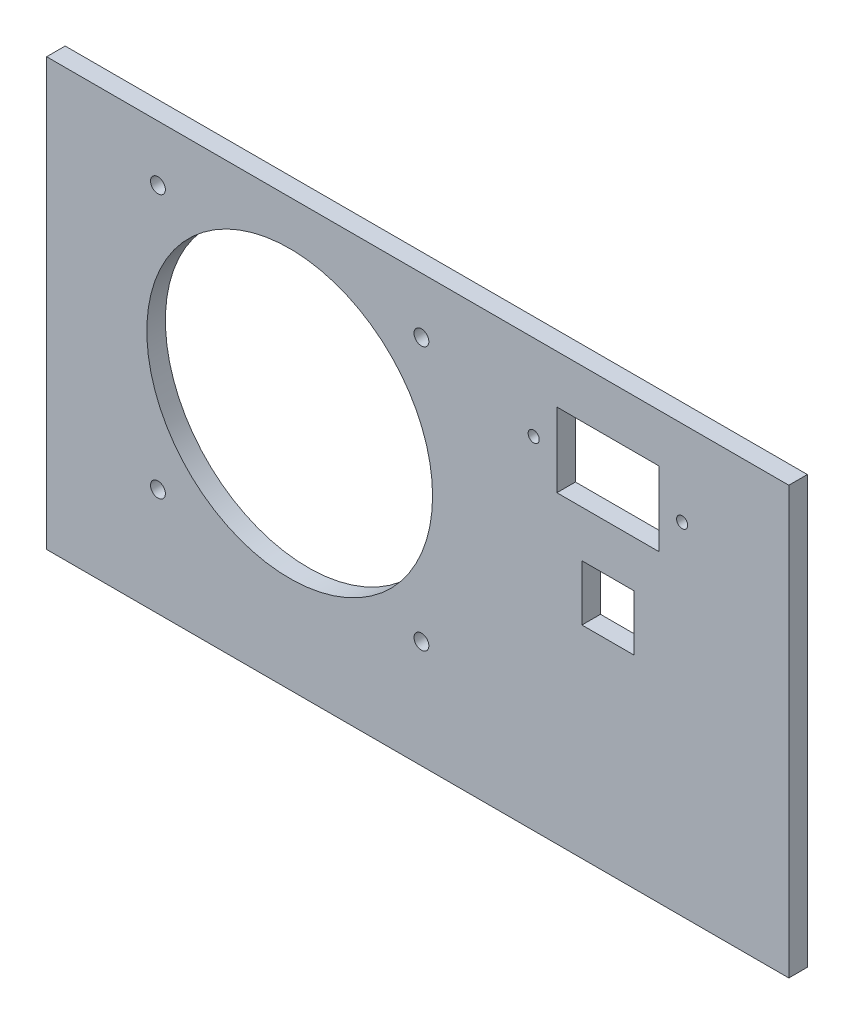
ISO-10303-21;
HEADER;
FILE_DESCRIPTION(('STEP AP214'),'2;1');
FILE_NAME('part.step','',(''),(''),'','','');
FILE_SCHEMA(('AUTOMOTIVE_DESIGN { 1 0 10303 214 1 1 1 1 }'));
ENDSEC;
DATA;
#1=APPLICATION_CONTEXT('core data for automotive mechanical design processes');
#2=APPLICATION_PROTOCOL_DEFINITION('international standard','automotive_design',2000,#1);
#3=PRODUCT_CONTEXT('',#1,'mechanical');
#4=PRODUCT('Part','Part','',(#3));
#5=PRODUCT_RELATED_PRODUCT_CATEGORY('part','',(#4));
#6=PRODUCT_DEFINITION_FORMATION('','',#4);
#7=PRODUCT_DEFINITION_CONTEXT('part definition',#1,'design');
#8=PRODUCT_DEFINITION('design','',#6,#7);
#9=PRODUCT_DEFINITION_SHAPE('','',#8);
#10=(LENGTH_UNIT() NAMED_UNIT(*) SI_UNIT(.MILLI.,.METRE.));
#11=(NAMED_UNIT(*) PLANE_ANGLE_UNIT() SI_UNIT($,.RADIAN.));
#12=(NAMED_UNIT(*) SI_UNIT($,.STERADIAN.) SOLID_ANGLE_UNIT());
#13=UNCERTAINTY_MEASURE_WITH_UNIT(LENGTH_MEASURE(1.E-05),#10,'distance_accuracy_value','');
#14=(GEOMETRIC_REPRESENTATION_CONTEXT(3) GLOBAL_UNCERTAINTY_ASSIGNED_CONTEXT((#13)) GLOBAL_UNIT_ASSIGNED_CONTEXT((#10,
#11,#12)) REPRESENTATION_CONTEXT('',''));
#15=CARTESIAN_POINT('',(0.,0.,0.));
#16=DIRECTION('',(0.,0.,1.));
#17=DIRECTION('',(1.,0.,0.));
#18=AXIS2_PLACEMENT_3D('',#15,#16,#17);
#19=CARTESIAN_POINT('',(0.,0.,5.));
#20=DIRECTION('',(0.,0.,-1.));
#21=DIRECTION('',(-1.,0.,0.));
#22=AXIS2_PLACEMENT_3D('',#19,#20,#21);
#23=PLANE('',#22);
#24=CARTESIAN_POINT('',(31.25,34.5,5.));
#25=DIRECTION('',(0.,0.,1.));
#26=DIRECTION('',(-1.,0.,0.));
#27=AXIS2_PLACEMENT_3D('',#24,#25,#26);
#28=CIRCLE('',#27,1.5);
#29=CARTESIAN_POINT('',(29.75,34.5,5.));
#30=VERTEX_POINT('',#29);
#31=EDGE_CURVE('E158',#30,#30,#28,.T.);
#32=ORIENTED_EDGE('',*,*,#31,.F.);
#33=EDGE_LOOP('',(#32));
#34=FACE_BOUND('',#33,.T.);
#35=CARTESIAN_POINT('',(71.25,34.5,5.));
#36=DIRECTION('',(0.,0.,1.));
#37=DIRECTION('',(1.,0.,0.));
#38=AXIS2_PLACEMENT_3D('',#35,#36,#37);
#39=CIRCLE('',#38,1.5);
#40=CARTESIAN_POINT('',(72.75,34.5,5.));
#41=VERTEX_POINT('',#40);
#42=EDGE_CURVE('E164',#41,#41,#39,.T.);
#43=ORIENTED_EDGE('',*,*,#42,.F.);
#44=EDGE_LOOP('',(#43));
#45=FACE_BOUND('',#44,.T.);
#46=DIRECTION('',(0.,1.,0.));
#47=VECTOR('',#46,1.);
#48=CARTESIAN_POINT('',(65.,24.5,5.));
#49=LINE('',#48,#47);
#50=CARTESIAN_POINT('',(65.,24.5,5.));
#51=VERTEX_POINT('',#50);
#52=CARTESIAN_POINT('',(65.,44.5,5.));
#53=VERTEX_POINT('',#52);
#54=EDGE_CURVE('E170',#51,#53,#49,.T.);
#55=ORIENTED_EDGE('',*,*,#54,.F.);
#56=DIRECTION('',(1.,0.,0.));
#57=VECTOR('',#56,1.);
#58=CARTESIAN_POINT('',(37.5,24.5,5.));
#59=LINE('',#58,#57);
#60=CARTESIAN_POINT('',(37.5,24.5,5.));
#61=VERTEX_POINT('',#60);
#62=EDGE_CURVE('E178',#61,#51,#59,.T.);
#63=ORIENTED_EDGE('',*,*,#62,.F.);
#64=DIRECTION('',(0.,-1.,0.));
#65=VECTOR('',#64,1.);
#66=CARTESIAN_POINT('',(37.5,24.5,5.));
#67=LINE('',#66,#65);
#68=CARTESIAN_POINT('',(37.5,44.5,5.));
#69=VERTEX_POINT('',#68);
#70=EDGE_CURVE('E175',#69,#61,#67,.T.);
#71=ORIENTED_EDGE('',*,*,#70,.F.);
#72=DIRECTION('',(-1.,0.,0.));
#73=VECTOR('',#72,1.);
#74=CARTESIAN_POINT('',(37.5,44.5,5.));
#75=LINE('',#74,#73);
#76=EDGE_CURVE('E172',#53,#69,#75,.T.);
#77=ORIENTED_EDGE('',*,*,#76,.F.);
#78=EDGE_LOOP('',(#55,#63,#71,#77));
#79=FACE_BOUND('',#78,.T.);
#80=DIRECTION('',(0.,1.,0.));
#81=VECTOR('',#80,1.);
#82=CARTESIAN_POINT('',(100.,-57.5,5.));
#83=LINE('',#82,#81);
#84=CARTESIAN_POINT('',(100.,-57.5,5.));
#85=VERTEX_POINT('',#84);
#86=CARTESIAN_POINT('',(100.,57.5,5.));
#87=VERTEX_POINT('',#86);
#88=EDGE_CURVE('E231',#85,#87,#83,.T.);
#89=ORIENTED_EDGE('',*,*,#88,.T.);
#90=DIRECTION('',(-1.,0.,0.));
#91=VECTOR('',#90,1.);
#92=CARTESIAN_POINT('',(-100.,57.5,5.));
#93=LINE('',#92,#91);
#94=CARTESIAN_POINT('',(-100.,57.5,5.));
#95=VERTEX_POINT('',#94);
#96=EDGE_CURVE('E234',#87,#95,#93,.T.);
#97=ORIENTED_EDGE('',*,*,#96,.T.);
#98=DIRECTION('',(0.,-1.,0.));
#99=VECTOR('',#98,1.);
#100=CARTESIAN_POINT('',(-100.,-57.5,5.));
#101=LINE('',#100,#99);
#102=CARTESIAN_POINT('',(-100.,-57.5,5.));
#103=VERTEX_POINT('',#102);
#104=EDGE_CURVE('E237',#95,#103,#101,.T.);
#105=ORIENTED_EDGE('',*,*,#104,.T.);
#106=DIRECTION('',(1.,0.,0.));
#107=VECTOR('',#106,1.);
#108=CARTESIAN_POINT('',(-100.,-57.5,5.));
#109=LINE('',#108,#107);
#110=EDGE_CURVE('E239',#103,#85,#109,.T.);
#111=ORIENTED_EDGE('',*,*,#110,.T.);
#112=EDGE_LOOP('',(#89,#97,#105,#111));
#113=FACE_BOUND('',#112,.T.);
#114=CARTESIAN_POINT('',(-34.5,7.,5.));
#115=DIRECTION('',(0.,0.,1.));
#116=DIRECTION('',(1.,0.,0.));
#117=AXIS2_PLACEMENT_3D('',#114,#115,#116);
#118=CIRCLE('',#117,38.5);
#119=CARTESIAN_POINT('',(4.00000000000001,7.,5.));
#120=VERTEX_POINT('',#119);
#121=EDGE_CURVE('E225',#120,#120,#118,.T.);
#122=ORIENTED_EDGE('',*,*,#121,.F.);
#123=EDGE_LOOP('',(#122));
#124=FACE_BOUND('',#123,.T.);
#125=CARTESIAN_POINT('',(-70.,42.5,5.));
#126=DIRECTION('',(0.,0.,1.));
#127=DIRECTION('',(1.,0.,0.));
#128=AXIS2_PLACEMENT_3D('',#125,#126,#127);
#129=CIRCLE('',#128,2.);
#130=CARTESIAN_POINT('',(-68.,42.5,5.));
#131=VERTEX_POINT('',#130);
#132=EDGE_CURVE('E219',#131,#131,#129,.T.);
#133=ORIENTED_EDGE('',*,*,#132,.F.);
#134=EDGE_LOOP('',(#133));
#135=FACE_BOUND('',#134,.T.);
#136=CARTESIAN_POINT('',(1.00000000000016,42.5000000000001,5.));
#137=DIRECTION('',(0.,0.,1.));
#138=DIRECTION('',(1.,0.,0.));
#139=AXIS2_PLACEMENT_3D('',#136,#137,#138);
#140=CIRCLE('',#139,2.);
#141=CARTESIAN_POINT('',(3.00000000000016,42.5000000000001,5.));
#142=VERTEX_POINT('',#141);
#143=EDGE_CURVE('E213',#142,#142,#140,.T.);
#144=ORIENTED_EDGE('',*,*,#143,.F.);
#145=EDGE_LOOP('',(#144));
#146=FACE_BOUND('',#145,.T.);
#147=CARTESIAN_POINT('',(1.00000000000003,-28.5,5.));
#148=DIRECTION('',(0.,0.,1.));
#149=DIRECTION('',(1.,0.,0.));
#150=AXIS2_PLACEMENT_3D('',#147,#148,#149);
#151=CIRCLE('',#150,2.);
#152=CARTESIAN_POINT('',(3.00000000000003,-28.5,5.));
#153=VERTEX_POINT('',#152);
#154=EDGE_CURVE('E207',#153,#153,#151,.T.);
#155=ORIENTED_EDGE('',*,*,#154,.F.);
#156=EDGE_LOOP('',(#155));
#157=FACE_BOUND('',#156,.T.);
#158=CARTESIAN_POINT('',(-70.0000000000001,-28.4999999999996,5.));
#159=DIRECTION('',(0.,0.,1.));
#160=DIRECTION('',(1.,0.,0.));
#161=AXIS2_PLACEMENT_3D('',#158,#159,#160);
#162=CIRCLE('',#161,2.);
#163=CARTESIAN_POINT('',(-68.0000000000001,-28.4999999999996,5.));
#164=VERTEX_POINT('',#163);
#165=EDGE_CURVE('E201',#164,#164,#162,.T.);
#166=ORIENTED_EDGE('',*,*,#165,.F.);
#167=EDGE_LOOP('',(#166));
#168=FACE_BOUND('',#167,.T.);
#169=DIRECTION('',(0.,1.,0.));
#170=VECTOR('',#169,1.);
#171=CARTESIAN_POINT('',(58.25,12.,5.));
#172=LINE('',#171,#170);
#173=CARTESIAN_POINT('',(58.25,-2.99999999999999,5.));
#174=VERTEX_POINT('',#173);
#175=CARTESIAN_POINT('',(58.25,12.,5.));
#176=VERTEX_POINT('',#175);
#177=EDGE_CURVE('E122',#174,#176,#172,.T.);
#178=ORIENTED_EDGE('',*,*,#177,.F.);
#179=DIRECTION('',(1.,0.,0.));
#180=VECTOR('',#179,1.);
#181=CARTESIAN_POINT('',(44.25,-2.99999999999999,5.));
#182=LINE('',#181,#180);
#183=CARTESIAN_POINT('',(44.25,-2.99999999999999,5.));
#184=VERTEX_POINT('',#183);
#185=EDGE_CURVE('E144',#184,#174,#182,.T.);
#186=ORIENTED_EDGE('',*,*,#185,.F.);
#187=DIRECTION('',(0.,-1.,0.));
#188=VECTOR('',#187,1.);
#189=CARTESIAN_POINT('',(44.25,12.,5.));
#190=LINE('',#189,#188);
#191=CARTESIAN_POINT('',(44.25,12.,5.));
#192=VERTEX_POINT('',#191);
#193=EDGE_CURVE('E142',#192,#184,#190,.T.);
#194=ORIENTED_EDGE('',*,*,#193,.F.);
#195=DIRECTION('',(-1.,0.,0.));
#196=VECTOR('',#195,1.);
#197=CARTESIAN_POINT('',(44.25,12.,5.));
#198=LINE('',#197,#196);
#199=EDGE_CURVE('E130',#176,#192,#198,.T.);
#200=ORIENTED_EDGE('',*,*,#199,.F.);
#201=EDGE_LOOP('',(#178,#186,#194,#200));
#202=FACE_BOUND('',#201,.T.);
#203=ADVANCED_FACE('F33',(#34,#45,#79,#113,#124,#135,#146,#157,#168,#202),#23,.F.);
#204=CARTESIAN_POINT('',(0.,0.,0.));
#205=DIRECTION('',(0.,0.,-1.));
#206=DIRECTION('',(-1.,0.,0.));
#207=AXIS2_PLACEMENT_3D('',#204,#205,#206);
#208=PLANE('',#207);
#209=CARTESIAN_POINT('',(71.25,34.5,0.));
#210=DIRECTION('',(0.,0.,1.));
#211=DIRECTION('',(1.,0.,0.));
#212=AXIS2_PLACEMENT_3D('',#209,#210,#211);
#213=CIRCLE('',#212,1.5);
#214=CARTESIAN_POINT('',(72.75,34.5,0.));
#215=VERTEX_POINT('',#214);
#216=EDGE_CURVE('E161',#215,#215,#213,.T.);
#217=ORIENTED_EDGE('',*,*,#216,.T.);
#218=EDGE_LOOP('',(#217));
#219=FACE_BOUND('',#218,.T.);
#220=CARTESIAN_POINT('',(1.00000000000003,-28.5,0.));
#221=DIRECTION('',(0.,0.,1.));
#222=DIRECTION('',(1.,0.,0.));
#223=AXIS2_PLACEMENT_3D('',#220,#221,#222);
#224=CIRCLE('',#223,2.);
#225=CARTESIAN_POINT('',(3.00000000000003,-28.5,0.));
#226=VERTEX_POINT('',#225);
#227=EDGE_CURVE('E204',#226,#226,#224,.T.);
#228=ORIENTED_EDGE('',*,*,#227,.T.);
#229=EDGE_LOOP('',(#228));
#230=FACE_BOUND('',#229,.T.);
#231=CARTESIAN_POINT('',(-70.,42.5,0.));
#232=DIRECTION('',(0.,0.,1.));
#233=DIRECTION('',(1.,0.,0.));
#234=AXIS2_PLACEMENT_3D('',#231,#232,#233);
#235=CIRCLE('',#234,2.);
#236=CARTESIAN_POINT('',(-68.,42.5,0.));
#237=VERTEX_POINT('',#236);
#238=EDGE_CURVE('E216',#237,#237,#235,.T.);
#239=ORIENTED_EDGE('',*,*,#238,.T.);
#240=EDGE_LOOP('',(#239));
#241=FACE_BOUND('',#240,.T.);
#242=DIRECTION('',(0.,1.,0.));
#243=VECTOR('',#242,1.);
#244=CARTESIAN_POINT('',(100.,-57.5,0.));
#245=LINE('',#244,#243);
#246=CARTESIAN_POINT('',(100.,-57.5,0.));
#247=VERTEX_POINT('',#246);
#248=CARTESIAN_POINT('',(100.,57.5,0.));
#249=VERTEX_POINT('',#248);
#250=EDGE_CURVE('E228',#247,#249,#245,.T.);
#251=ORIENTED_EDGE('',*,*,#250,.F.);
#252=DIRECTION('',(1.,0.,0.));
#253=VECTOR('',#252,1.);
#254=CARTESIAN_POINT('',(-100.,-57.5,0.));
#255=LINE('',#254,#253);
#256=CARTESIAN_POINT('',(-100.,-57.5,0.));
#257=VERTEX_POINT('',#256);
#258=EDGE_CURVE('E235',#257,#247,#255,.T.);
#259=ORIENTED_EDGE('',*,*,#258,.F.);
#260=DIRECTION('',(0.,-1.,0.));
#261=VECTOR('',#260,1.);
#262=CARTESIAN_POINT('',(-100.,-57.5,0.));
#263=LINE('',#262,#261);
#264=CARTESIAN_POINT('',(-100.,57.5,0.));
#265=VERTEX_POINT('',#264);
#266=EDGE_CURVE('E246',#265,#257,#263,.T.);
#267=ORIENTED_EDGE('',*,*,#266,.F.);
#268=DIRECTION('',(-1.,0.,0.));
#269=VECTOR('',#268,1.);
#270=CARTESIAN_POINT('',(-100.,57.5,0.));
#271=LINE('',#270,#269);
#272=EDGE_CURVE('E244',#249,#265,#271,.T.);
#273=ORIENTED_EDGE('',*,*,#272,.F.);
#274=EDGE_LOOP('',(#251,#259,#267,#273));
#275=FACE_BOUND('',#274,.T.);
#276=CARTESIAN_POINT('',(-34.5,7.,0.));
#277=DIRECTION('',(0.,0.,1.));
#278=DIRECTION('',(1.,0.,0.));
#279=AXIS2_PLACEMENT_3D('',#276,#277,#278);
#280=CIRCLE('',#279,38.5);
#281=CARTESIAN_POINT('',(4.00000000000001,7.,0.));
#282=VERTEX_POINT('',#281);
#283=EDGE_CURVE('E222',#282,#282,#280,.T.);
#284=ORIENTED_EDGE('',*,*,#283,.T.);
#285=EDGE_LOOP('',(#284));
#286=FACE_BOUND('',#285,.T.);
#287=CARTESIAN_POINT('',(1.00000000000016,42.5000000000001,0.));
#288=DIRECTION('',(0.,0.,1.));
#289=DIRECTION('',(1.,0.,0.));
#290=AXIS2_PLACEMENT_3D('',#287,#288,#289);
#291=CIRCLE('',#290,2.);
#292=CARTESIAN_POINT('',(3.00000000000016,42.5000000000001,0.));
#293=VERTEX_POINT('',#292);
#294=EDGE_CURVE('E210',#293,#293,#291,.T.);
#295=ORIENTED_EDGE('',*,*,#294,.T.);
#296=EDGE_LOOP('',(#295));
#297=FACE_BOUND('',#296,.T.);
#298=CARTESIAN_POINT('',(-70.0000000000001,-28.4999999999996,0.));
#299=DIRECTION('',(0.,0.,1.));
#300=DIRECTION('',(1.,0.,0.));
#301=AXIS2_PLACEMENT_3D('',#298,#299,#300);
#302=CIRCLE('',#301,2.);
#303=CARTESIAN_POINT('',(-68.0000000000001,-28.4999999999996,0.));
#304=VERTEX_POINT('',#303);
#305=EDGE_CURVE('E200',#304,#304,#302,.T.);
#306=ORIENTED_EDGE('',*,*,#305,.T.);
#307=EDGE_LOOP('',(#306));
#308=FACE_BOUND('',#307,.T.);
#309=DIRECTION('',(1.,0.,0.));
#310=VECTOR('',#309,1.);
#311=CARTESIAN_POINT('',(37.5,24.5,0.));
#312=LINE('',#311,#310);
#313=CARTESIAN_POINT('',(37.5,24.5,0.));
#314=VERTEX_POINT('',#313);
#315=CARTESIAN_POINT('',(65.,24.5,0.));
#316=VERTEX_POINT('',#315);
#317=EDGE_CURVE('E173',#314,#316,#312,.T.);
#318=ORIENTED_EDGE('',*,*,#317,.T.);
#319=DIRECTION('',(0.,1.,0.));
#320=VECTOR('',#319,1.);
#321=CARTESIAN_POINT('',(65.,24.5,0.));
#322=LINE('',#321,#320);
#323=CARTESIAN_POINT('',(65.,44.5,0.));
#324=VERTEX_POINT('',#323);
#325=EDGE_CURVE('E167',#316,#324,#322,.T.);
#326=ORIENTED_EDGE('',*,*,#325,.T.);
#327=DIRECTION('',(-1.,0.,0.));
#328=VECTOR('',#327,1.);
#329=CARTESIAN_POINT('',(37.5,44.5,0.));
#330=LINE('',#329,#328);
#331=CARTESIAN_POINT('',(37.5,44.5,0.));
#332=VERTEX_POINT('',#331);
#333=EDGE_CURVE('E183',#324,#332,#330,.T.);
#334=ORIENTED_EDGE('',*,*,#333,.T.);
#335=DIRECTION('',(0.,-1.,0.));
#336=VECTOR('',#335,1.);
#337=CARTESIAN_POINT('',(37.5,24.5,0.));
#338=LINE('',#337,#336);
#339=EDGE_CURVE('E186',#332,#314,#338,.T.);
#340=ORIENTED_EDGE('',*,*,#339,.T.);
#341=EDGE_LOOP('',(#318,#326,#334,#340));
#342=FACE_BOUND('',#341,.T.);
#343=CARTESIAN_POINT('',(31.25,34.5,0.));
#344=DIRECTION('',(0.,0.,1.));
#345=DIRECTION('',(-1.,0.,0.));
#346=AXIS2_PLACEMENT_3D('',#343,#344,#345);
#347=CIRCLE('',#346,1.5);
#348=CARTESIAN_POINT('',(29.75,34.5,0.));
#349=VERTEX_POINT('',#348);
#350=EDGE_CURVE('E138',#349,#349,#347,.T.);
#351=ORIENTED_EDGE('',*,*,#350,.T.);
#352=EDGE_LOOP('',(#351));
#353=FACE_BOUND('',#352,.T.);
#354=DIRECTION('',(1.,0.,0.));
#355=VECTOR('',#354,1.);
#356=CARTESIAN_POINT('',(44.25,-2.99999999999999,0.));
#357=LINE('',#356,#355);
#358=CARTESIAN_POINT('',(44.25,-2.99999999999999,0.));
#359=VERTEX_POINT('',#358);
#360=CARTESIAN_POINT('',(58.25,-2.99999999999999,0.));
#361=VERTEX_POINT('',#360);
#362=EDGE_CURVE('E131',#359,#361,#357,.T.);
#363=ORIENTED_EDGE('',*,*,#362,.T.);
#364=DIRECTION('',(0.,1.,0.));
#365=VECTOR('',#364,1.);
#366=CARTESIAN_POINT('',(58.25,12.,0.));
#367=LINE('',#366,#365);
#368=CARTESIAN_POINT('',(58.25,12.,0.));
#369=VERTEX_POINT('',#368);
#370=EDGE_CURVE('E56',#361,#369,#367,.T.);
#371=ORIENTED_EDGE('',*,*,#370,.T.);
#372=DIRECTION('',(-1.,0.,0.));
#373=VECTOR('',#372,1.);
#374=CARTESIAN_POINT('',(44.25,12.,0.));
#375=LINE('',#374,#373);
#376=CARTESIAN_POINT('',(44.25,12.,0.));
#377=VERTEX_POINT('',#376);
#378=EDGE_CURVE('E137',#369,#377,#375,.T.);
#379=ORIENTED_EDGE('',*,*,#378,.T.);
#380=DIRECTION('',(0.,-1.,0.));
#381=VECTOR('',#380,1.);
#382=CARTESIAN_POINT('',(44.25,12.,0.));
#383=LINE('',#382,#381);
#384=EDGE_CURVE('E150',#377,#359,#383,.T.);
#385=ORIENTED_EDGE('',*,*,#384,.T.);
#386=EDGE_LOOP('',(#363,#371,#379,#385));
#387=FACE_BOUND('',#386,.T.);
#388=ADVANCED_FACE('F264',(#219,#230,#241,#275,#286,#297,#308,#342,#353,#387),#208,.T.);
#389=CARTESIAN_POINT('',(100.,-57.5,5.));
#390=DIRECTION('',(-1.,0.,0.));
#391=DIRECTION('',(0.,0.,1.));
#392=AXIS2_PLACEMENT_3D('',#389,#390,#391);
#393=PLANE('',#392);
#394=ORIENTED_EDGE('',*,*,#250,.T.);
#395=DIRECTION('',(0.,0.,-1.));
#396=VECTOR('',#395,1.);
#397=CARTESIAN_POINT('',(100.,57.5,5.));
#398=LINE('',#397,#396);
#399=EDGE_CURVE('E11',#87,#249,#398,.T.);
#400=ORIENTED_EDGE('',*,*,#399,.F.);
#401=ORIENTED_EDGE('',*,*,#88,.F.);
#402=DIRECTION('',(0.,0.,-1.));
#403=VECTOR('',#402,1.);
#404=CARTESIAN_POINT('',(100.,-57.5,5.));
#405=LINE('',#404,#403);
#406=EDGE_CURVE('E241',#85,#247,#405,.T.);
#407=ORIENTED_EDGE('',*,*,#406,.T.);
#408=EDGE_LOOP('',(#394,#400,#401,#407));
#409=FACE_BOUND('',#408,.T.);
#410=ADVANCED_FACE('F35',(#409),#393,.F.);
#411=CARTESIAN_POINT('',(-100.,57.5,5.));
#412=DIRECTION('',(0.,-1.,0.));
#413=DIRECTION('',(0.,0.,-1.));
#414=AXIS2_PLACEMENT_3D('',#411,#412,#413);
#415=PLANE('',#414);
#416=ORIENTED_EDGE('',*,*,#272,.T.);
#417=DIRECTION('',(0.,0.,-1.));
#418=VECTOR('',#417,1.);
#419=CARTESIAN_POINT('',(-100.,57.5,5.));
#420=LINE('',#419,#418);
#421=EDGE_CURVE('E41',#95,#265,#420,.T.);
#422=ORIENTED_EDGE('',*,*,#421,.F.);
#423=ORIENTED_EDGE('',*,*,#96,.F.);
#424=ORIENTED_EDGE('',*,*,#399,.T.);
#425=EDGE_LOOP('',(#416,#422,#423,#424));
#426=FACE_BOUND('',#425,.T.);
#427=ADVANCED_FACE('F275',(#426),#415,.F.);
#428=CARTESIAN_POINT('',(-100.,-57.5,5.));
#429=DIRECTION('',(1.,0.,0.));
#430=DIRECTION('',(0.,0.,-1.));
#431=AXIS2_PLACEMENT_3D('',#428,#429,#430);
#432=PLANE('',#431);
#433=ORIENTED_EDGE('',*,*,#266,.T.);
#434=DIRECTION('',(0.,0.,-1.));
#435=VECTOR('',#434,1.);
#436=CARTESIAN_POINT('',(-100.,-57.5,5.));
#437=LINE('',#436,#435);
#438=EDGE_CURVE('E251',#103,#257,#437,.T.);
#439=ORIENTED_EDGE('',*,*,#438,.F.);
#440=ORIENTED_EDGE('',*,*,#104,.F.);
#441=ORIENTED_EDGE('',*,*,#421,.T.);
#442=EDGE_LOOP('',(#433,#439,#440,#441));
#443=FACE_BOUND('',#442,.T.);
#444=ADVANCED_FACE('F258',(#443),#432,.F.);
#445=CARTESIAN_POINT('',(-100.,-57.5,5.));
#446=DIRECTION('',(0.,1.,0.));
#447=DIRECTION('',(0.,0.,1.));
#448=AXIS2_PLACEMENT_3D('',#445,#446,#447);
#449=PLANE('',#448);
#450=ORIENTED_EDGE('',*,*,#258,.T.);
#451=ORIENTED_EDGE('',*,*,#406,.F.);
#452=ORIENTED_EDGE('',*,*,#110,.F.);
#453=ORIENTED_EDGE('',*,*,#438,.T.);
#454=EDGE_LOOP('',(#450,#451,#452,#453));
#455=FACE_BOUND('',#454,.T.);
#456=ADVANCED_FACE('F268',(#455),#449,.F.);
#457=CARTESIAN_POINT('',(-34.5,7.,5.));
#458=DIRECTION('',(0.,0.,-1.));
#459=DIRECTION('',(-1.,0.,0.));
#460=AXIS2_PLACEMENT_3D('',#457,#458,#459);
#461=CYLINDRICAL_SURFACE('',#460,38.5);
#462=ORIENTED_EDGE('',*,*,#121,.T.);
#463=EDGE_LOOP('',(#462));
#464=FACE_BOUND('',#463,.T.);
#465=ORIENTED_EDGE('',*,*,#283,.F.);
#466=EDGE_LOOP('',(#465));
#467=FACE_BOUND('',#466,.T.);
#468=ADVANCED_FACE('F293',(#464,#467),#461,.F.);
#469=CARTESIAN_POINT('',(-70.,42.5,5.));
#470=DIRECTION('',(0.,0.,-1.));
#471=DIRECTION('',(-1.,0.,0.));
#472=AXIS2_PLACEMENT_3D('',#469,#470,#471);
#473=CYLINDRICAL_SURFACE('',#472,2.);
#474=ORIENTED_EDGE('',*,*,#132,.T.);
#475=EDGE_LOOP('',(#474));
#476=FACE_BOUND('',#475,.T.);
#477=ORIENTED_EDGE('',*,*,#238,.F.);
#478=EDGE_LOOP('',(#477));
#479=FACE_BOUND('',#478,.T.);
#480=ADVANCED_FACE('F300',(#476,#479),#473,.F.);
#481=CARTESIAN_POINT('',(1.00000000000016,42.5000000000001,5.));
#482=DIRECTION('',(0.,0.,-1.));
#483=DIRECTION('',(-1.,0.,0.));
#484=AXIS2_PLACEMENT_3D('',#481,#482,#483);
#485=CYLINDRICAL_SURFACE('',#484,2.);
#486=ORIENTED_EDGE('',*,*,#143,.T.);
#487=EDGE_LOOP('',(#486));
#488=FACE_BOUND('',#487,.T.);
#489=ORIENTED_EDGE('',*,*,#294,.F.);
#490=EDGE_LOOP('',(#489));
#491=FACE_BOUND('',#490,.T.);
#492=ADVANCED_FACE('F305',(#488,#491),#485,.F.);
#493=CARTESIAN_POINT('',(1.00000000000003,-28.5,5.));
#494=DIRECTION('',(0.,0.,-1.));
#495=DIRECTION('',(-1.,0.,0.));
#496=AXIS2_PLACEMENT_3D('',#493,#494,#495);
#497=CYLINDRICAL_SURFACE('',#496,2.);
#498=ORIENTED_EDGE('',*,*,#154,.T.);
#499=EDGE_LOOP('',(#498));
#500=FACE_BOUND('',#499,.T.);
#501=ORIENTED_EDGE('',*,*,#227,.F.);
#502=EDGE_LOOP('',(#501));
#503=FACE_BOUND('',#502,.T.);
#504=ADVANCED_FACE('F361',(#500,#503),#497,.F.);
#505=CARTESIAN_POINT('',(-70.0000000000001,-28.4999999999996,5.));
#506=DIRECTION('',(0.,0.,-1.));
#507=DIRECTION('',(-1.,0.,0.));
#508=AXIS2_PLACEMENT_3D('',#505,#506,#507);
#509=CYLINDRICAL_SURFACE('',#508,2.);
#510=ORIENTED_EDGE('',*,*,#165,.T.);
#511=EDGE_LOOP('',(#510));
#512=FACE_BOUND('',#511,.T.);
#513=ORIENTED_EDGE('',*,*,#305,.F.);
#514=EDGE_LOOP('',(#513));
#515=FACE_BOUND('',#514,.T.);
#516=ADVANCED_FACE('F357',(#512,#515),#509,.F.);
#517=CARTESIAN_POINT('',(65.,24.5,5.));
#518=DIRECTION('',(-1.,0.,0.));
#519=DIRECTION('',(0.,0.,1.));
#520=AXIS2_PLACEMENT_3D('',#517,#518,#519);
#521=PLANE('',#520);
#522=ORIENTED_EDGE('',*,*,#325,.F.);
#523=DIRECTION('',(0.,0.,-1.));
#524=VECTOR('',#523,1.);
#525=CARTESIAN_POINT('',(65.,24.5,5.));
#526=LINE('',#525,#524);
#527=EDGE_CURVE('E180',#51,#316,#526,.T.);
#528=ORIENTED_EDGE('',*,*,#527,.F.);
#529=ORIENTED_EDGE('',*,*,#54,.T.);
#530=DIRECTION('',(0.,0.,-1.));
#531=VECTOR('',#530,1.);
#532=CARTESIAN_POINT('',(65.,44.5,5.));
#533=LINE('',#532,#531);
#534=EDGE_CURVE('E197',#53,#324,#533,.T.);
#535=ORIENTED_EDGE('',*,*,#534,.T.);
#536=EDGE_LOOP('',(#522,#528,#529,#535));
#537=FACE_BOUND('',#536,.T.);
#538=ADVANCED_FACE('F353',(#537),#521,.T.);
#539=CARTESIAN_POINT('',(37.5,44.5,5.));
#540=DIRECTION('',(0.,-1.,0.));
#541=DIRECTION('',(0.,0.,-1.));
#542=AXIS2_PLACEMENT_3D('',#539,#540,#541);
#543=PLANE('',#542);
#544=ORIENTED_EDGE('',*,*,#333,.F.);
#545=ORIENTED_EDGE('',*,*,#534,.F.);
#546=ORIENTED_EDGE('',*,*,#76,.T.);
#547=DIRECTION('',(0.,0.,-1.));
#548=VECTOR('',#547,1.);
#549=CARTESIAN_POINT('',(37.5,44.5,5.));
#550=LINE('',#549,#548);
#551=EDGE_CURVE('E195',#69,#332,#550,.T.);
#552=ORIENTED_EDGE('',*,*,#551,.T.);
#553=EDGE_LOOP('',(#544,#545,#546,#552));
#554=FACE_BOUND('',#553,.T.);
#555=ADVANCED_FACE('F349',(#554),#543,.T.);
#556=CARTESIAN_POINT('',(37.5,24.5,5.));
#557=DIRECTION('',(1.,0.,0.));
#558=DIRECTION('',(0.,0.,-1.));
#559=AXIS2_PLACEMENT_3D('',#556,#557,#558);
#560=PLANE('',#559);
#561=ORIENTED_EDGE('',*,*,#339,.F.);
#562=ORIENTED_EDGE('',*,*,#551,.F.);
#563=ORIENTED_EDGE('',*,*,#70,.T.);
#564=DIRECTION('',(0.,0.,-1.));
#565=VECTOR('',#564,1.);
#566=CARTESIAN_POINT('',(37.5,24.5,5.));
#567=LINE('',#566,#565);
#568=EDGE_CURVE('E193',#61,#314,#567,.T.);
#569=ORIENTED_EDGE('',*,*,#568,.T.);
#570=EDGE_LOOP('',(#561,#562,#563,#569));
#571=FACE_BOUND('',#570,.T.);
#572=ADVANCED_FACE('F345',(#571),#560,.T.);
#573=CARTESIAN_POINT('',(37.5,24.5,5.));
#574=DIRECTION('',(0.,1.,0.));
#575=DIRECTION('',(0.,0.,1.));
#576=AXIS2_PLACEMENT_3D('',#573,#574,#575);
#577=PLANE('',#576);
#578=ORIENTED_EDGE('',*,*,#317,.F.);
#579=ORIENTED_EDGE('',*,*,#568,.F.);
#580=ORIENTED_EDGE('',*,*,#62,.T.);
#581=ORIENTED_EDGE('',*,*,#527,.T.);
#582=EDGE_LOOP('',(#578,#579,#580,#581));
#583=FACE_BOUND('',#582,.T.);
#584=ADVANCED_FACE('F341',(#583),#577,.T.);
#585=CARTESIAN_POINT('',(71.25,34.5,5.));
#586=DIRECTION('',(0.,0.,-1.));
#587=DIRECTION('',(-1.,0.,0.));
#588=AXIS2_PLACEMENT_3D('',#585,#586,#587);
#589=CYLINDRICAL_SURFACE('',#588,1.5);
#590=ORIENTED_EDGE('',*,*,#42,.T.);
#591=EDGE_LOOP('',(#590));
#592=FACE_BOUND('',#591,.T.);
#593=ORIENTED_EDGE('',*,*,#216,.F.);
#594=EDGE_LOOP('',(#593));
#595=FACE_BOUND('',#594,.T.);
#596=ADVANCED_FACE('F337',(#592,#595),#589,.F.);
#597=CARTESIAN_POINT('',(31.25,34.5,5.));
#598=DIRECTION('',(0.,0.,-1.));
#599=DIRECTION('',(-1.,0.,0.));
#600=AXIS2_PLACEMENT_3D('',#597,#598,#599);
#601=CYLINDRICAL_SURFACE('',#600,1.5);
#602=ORIENTED_EDGE('',*,*,#31,.T.);
#603=EDGE_LOOP('',(#602));
#604=FACE_BOUND('',#603,.T.);
#605=ORIENTED_EDGE('',*,*,#350,.F.);
#606=EDGE_LOOP('',(#605));
#607=FACE_BOUND('',#606,.T.);
#608=ADVANCED_FACE('F334',(#604,#607),#601,.F.);
#609=CARTESIAN_POINT('',(58.25,12.,5.));
#610=DIRECTION('',(-1.,0.,0.));
#611=DIRECTION('',(0.,0.,1.));
#612=AXIS2_PLACEMENT_3D('',#609,#610,#611);
#613=PLANE('',#612);
#614=ORIENTED_EDGE('',*,*,#370,.F.);
#615=DIRECTION('',(0.,0.,-1.));
#616=VECTOR('',#615,1.);
#617=CARTESIAN_POINT('',(58.25,-2.99999999999999,5.));
#618=LINE('',#617,#616);
#619=EDGE_CURVE('E126',#174,#361,#618,.T.);
#620=ORIENTED_EDGE('',*,*,#619,.F.);
#621=ORIENTED_EDGE('',*,*,#177,.T.);
#622=DIRECTION('',(0.,0.,-1.));
#623=VECTOR('',#622,1.);
#624=CARTESIAN_POINT('',(58.25,12.,5.));
#625=LINE('',#624,#623);
#626=EDGE_CURVE('E125',#176,#369,#625,.T.);
#627=ORIENTED_EDGE('',*,*,#626,.T.);
#628=EDGE_LOOP('',(#614,#620,#621,#627));
#629=FACE_BOUND('',#628,.T.);
#630=ADVANCED_FACE('F124',(#629),#613,.T.);
#631=CARTESIAN_POINT('',(44.25,12.,5.));
#632=DIRECTION('',(0.,-1.,0.));
#633=DIRECTION('',(0.,0.,-1.));
#634=AXIS2_PLACEMENT_3D('',#631,#632,#633);
#635=PLANE('',#634);
#636=ORIENTED_EDGE('',*,*,#378,.F.);
#637=ORIENTED_EDGE('',*,*,#626,.F.);
#638=ORIENTED_EDGE('',*,*,#199,.T.);
#639=DIRECTION('',(0.,0.,-1.));
#640=VECTOR('',#639,1.);
#641=CARTESIAN_POINT('',(44.25,12.,5.));
#642=LINE('',#641,#640);
#643=EDGE_CURVE('E139',#192,#377,#642,.T.);
#644=ORIENTED_EDGE('',*,*,#643,.T.);
#645=EDGE_LOOP('',(#636,#637,#638,#644));
#646=FACE_BOUND('',#645,.T.);
#647=ADVANCED_FACE('F134',(#646),#635,.T.);
#648=CARTESIAN_POINT('',(44.25,12.,5.));
#649=DIRECTION('',(1.,0.,0.));
#650=DIRECTION('',(0.,0.,-1.));
#651=AXIS2_PLACEMENT_3D('',#648,#649,#650);
#652=PLANE('',#651);
#653=ORIENTED_EDGE('',*,*,#384,.F.);
#654=ORIENTED_EDGE('',*,*,#643,.F.);
#655=ORIENTED_EDGE('',*,*,#193,.T.);
#656=DIRECTION('',(0.,0.,-1.));
#657=VECTOR('',#656,1.);
#658=CARTESIAN_POINT('',(44.25,-2.99999999999999,5.));
#659=LINE('',#658,#657);
#660=EDGE_CURVE('E48',#184,#359,#659,.T.);
#661=ORIENTED_EDGE('',*,*,#660,.T.);
#662=EDGE_LOOP('',(#653,#654,#655,#661));
#663=FACE_BOUND('',#662,.T.);
#664=ADVANCED_FACE('F322',(#663),#652,.T.);
#665=CARTESIAN_POINT('',(44.25,-2.99999999999999,5.));
#666=DIRECTION('',(0.,1.,0.));
#667=DIRECTION('',(0.,0.,1.));
#668=AXIS2_PLACEMENT_3D('',#665,#666,#667);
#669=PLANE('',#668);
#670=ORIENTED_EDGE('',*,*,#362,.F.);
#671=ORIENTED_EDGE('',*,*,#660,.F.);
#672=ORIENTED_EDGE('',*,*,#185,.T.);
#673=ORIENTED_EDGE('',*,*,#619,.T.);
#674=EDGE_LOOP('',(#670,#671,#672,#673));
#675=FACE_BOUND('',#674,.T.);
#676=ADVANCED_FACE('F320',(#675),#669,.T.);
#677=CLOSED_SHELL('',(#203,#388,#410,#427,#444,#456,#468,#480,#492,#504,#516,#538,#555,#572,
#584,#596,#608,#630,#647,#664,#676));
#678=MANIFOLD_SOLID_BREP('B2',#677);
#679=ADVANCED_BREP_SHAPE_REPRESENTATION('',(#18,#678),#14);
#680=SHAPE_DEFINITION_REPRESENTATION(#9,#679);
ENDSEC;
END-ISO-10303-21;
